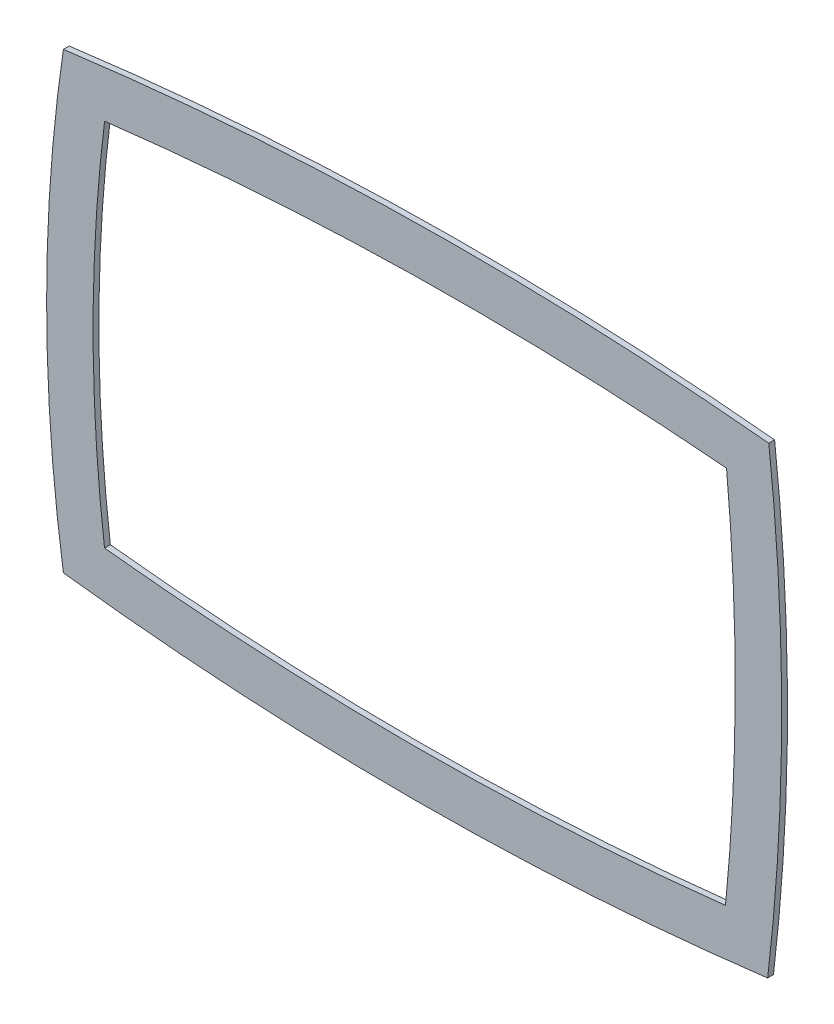
ISO-10303-21;
HEADER;
FILE_DESCRIPTION(('STEP AP214'),'2;1');
FILE_NAME('part.step','',(''),(''),'','','');
FILE_SCHEMA(('AUTOMOTIVE_DESIGN { 1 0 10303 214 1 1 1 1 }'));
ENDSEC;
DATA;
#1=APPLICATION_CONTEXT('core data for automotive mechanical design processes');
#2=APPLICATION_PROTOCOL_DEFINITION('international standard','automotive_design',2000,#1);
#3=PRODUCT_CONTEXT('',#1,'mechanical');
#4=PRODUCT('Part','Part','',(#3));
#5=PRODUCT_RELATED_PRODUCT_CATEGORY('part','',(#4));
#6=PRODUCT_DEFINITION_FORMATION('','',#4);
#7=PRODUCT_DEFINITION_CONTEXT('part definition',#1,'design');
#8=PRODUCT_DEFINITION('design','',#6,#7);
#9=PRODUCT_DEFINITION_SHAPE('','',#8);
#10=(LENGTH_UNIT() NAMED_UNIT(*) SI_UNIT(.MILLI.,.METRE.));
#11=(NAMED_UNIT(*) PLANE_ANGLE_UNIT() SI_UNIT($,.RADIAN.));
#12=(NAMED_UNIT(*) SI_UNIT($,.STERADIAN.) SOLID_ANGLE_UNIT());
#13=UNCERTAINTY_MEASURE_WITH_UNIT(LENGTH_MEASURE(1.E-05),#10,'distance_accuracy_value','');
#14=(GEOMETRIC_REPRESENTATION_CONTEXT(3) GLOBAL_UNCERTAINTY_ASSIGNED_CONTEXT((#13)) GLOBAL_UNIT_ASSIGNED_CONTEXT((#10,
#11,#12)) REPRESENTATION_CONTEXT('',''));
#15=CARTESIAN_POINT('',(0.,0.,0.));
#16=DIRECTION('',(0.,0.,1.));
#17=DIRECTION('',(1.,0.,0.));
#18=AXIS2_PLACEMENT_3D('',#15,#16,#17);
#19=CARTESIAN_POINT('',(0.,0.,0.05));
#20=DIRECTION('',(0.,0.,1.));
#21=DIRECTION('',(1.,0.,0.));
#22=AXIS2_PLACEMENT_3D('',#19,#20,#21);
#23=PLANE('',#22);
#24=CARTESIAN_POINT('',(10.28146360564,-0.07420751764335,0.05));
#25=DIRECTION('',(0.,0.,1.));
#26=DIRECTION('',(1.,0.,0.));
#27=AXIS2_PLACEMENT_3D('',#24,#25,#26);
#28=CIRCLE('',#27,12.87248318744);
#29=CARTESIAN_POINT('',(-2.49250575619559,-1.66371377865993,0.05));
#30=VERTEX_POINT('',#29);
#31=CARTESIAN_POINT('',(-2.49208272068601,1.51869475811894,0.05));
#32=VERTEX_POINT('',#31);
#33=EDGE_CURVE('E122',#30,#32,#28,.F.);
#34=ORIENTED_EDGE('',*,*,#33,.T.);
#35=CARTESIAN_POINT('',(0.6226355071522,-24.38683992378,0.05));
#36=DIRECTION('',(0.,0.,1.));
#37=DIRECTION('',(1.,0.,0.));
#38=AXIS2_PLACEMENT_3D('',#35,#36,#37);
#39=CIRCLE('',#38,26.09210985708);
#40=CARTESIAN_POINT('',(2.86177604570978,1.60901448500009,0.05));
#41=VERTEX_POINT('',#40);
#42=EDGE_CURVE('E131',#32,#41,#39,.F.);
#43=ORIENTED_EDGE('',*,*,#42,.T.);
#44=CARTESIAN_POINT('',(-13.94445100356,0.02340364021601,0.05));
#45=DIRECTION('',(0.,0.,1.));
#46=DIRECTION('',(1.,0.,0.));
#47=AXIS2_PLACEMENT_3D('',#44,#45,#46);
#48=CIRCLE('',#47,16.88085985318);
#49=CARTESIAN_POINT('',(2.85279013546879,-1.65472612233116,0.05));
#50=VERTEX_POINT('',#49);
#51=EDGE_CURVE('E128',#41,#50,#48,.F.);
#52=ORIENTED_EDGE('',*,*,#51,.T.);
#53=CARTESIAN_POINT('',(0.1394460000001,22.5443284803,0.05));
#54=DIRECTION('',(0.,0.,1.));
#55=DIRECTION('',(1.,0.,0.));
#56=AXIS2_PLACEMENT_3D('',#53,#54,#55);
#57=CIRCLE('',#56,24.35069773248);
#58=EDGE_CURVE('E125',#50,#30,#57,.F.);
#59=ORIENTED_EDGE('',*,*,#58,.T.);
#60=EDGE_LOOP('',(#34,#43,#52,#59));
#61=FACE_BOUND('',#60,.T.);
#62=CARTESIAN_POINT('',(10.28146360564,-0.07420751764323,0.05));
#63=DIRECTION('',(0.,0.,1.));
#64=DIRECTION('',(1.,0.,0.));
#65=AXIS2_PLACEMENT_3D('',#62,#63,#64);
#66=CIRCLE('',#65,13.27248318744);
#67=CARTESIAN_POINT('',(-2.84678960030275,-2.02556031033125,0.05));
#68=VERTEX_POINT('',#67);
#69=CARTESIAN_POINT('',(-2.84679521254649,1.87710751678514,0.05));
#70=VERTEX_POINT('',#69);
#71=EDGE_CURVE('E91',#68,#70,#66,.F.);
#72=ORIENTED_EDGE('',*,*,#71,.F.);
#73=CARTESIAN_POINT('',(0.1394460000001,22.5443284803,0.05));
#74=DIRECTION('',(0.,0.,1.));
#75=DIRECTION('',(1.,0.,0.));
#76=AXIS2_PLACEMENT_3D('',#73,#74,#75);
#77=CIRCLE('',#76,24.75069773248);
#78=CARTESIAN_POINT('',(3.21583247942406,-2.01443542331993,0.05));
#79=VERTEX_POINT('',#78);
#80=EDGE_CURVE('E20',#79,#68,#77,.F.);
#81=ORIENTED_EDGE('',*,*,#80,.F.);
#82=CARTESIAN_POINT('',(-13.94445100356,0.02340364021598,0.05));
#83=DIRECTION('',(0.,0.,1.));
#84=DIRECTION('',(1.,0.,0.));
#85=AXIS2_PLACEMENT_3D('',#82,#83,#84);
#86=CIRCLE('',#85,17.28085985318);
#87=CARTESIAN_POINT('',(3.22561768964782,1.97708179582017,0.05));
#88=VERTEX_POINT('',#87);
#89=EDGE_CURVE('E79',#88,#79,#86,.F.);
#90=ORIENTED_EDGE('',*,*,#89,.F.);
#91=CARTESIAN_POINT('',(0.6226355071522,-24.38683992378,0.05));
#92=DIRECTION('',(0.,0.,1.));
#93=DIRECTION('',(1.,0.,0.));
#94=AXIS2_PLACEMENT_3D('',#91,#92,#93);
#95=CIRCLE('',#94,26.49210985708);
#96=EDGE_CURVE('E98',#70,#88,#95,.F.);
#97=ORIENTED_EDGE('',*,*,#96,.F.);
#98=EDGE_LOOP('',(#72,#81,#90,#97));
#99=FACE_BOUND('',#98,.T.);
#100=ADVANCED_FACE('F17',(#61,#99),#23,.T.);
#101=CARTESIAN_POINT('',(0.1394460000001,22.5443284803,0.));
#102=DIRECTION('',(0.,0.,1.));
#103=DIRECTION('',(1.,0.,0.));
#104=AXIS2_PLACEMENT_3D('',#101,#102,#103);
#105=CYLINDRICAL_SURFACE('',#104,24.75069773248);
#106=DIRECTION('',(0.,0.,1.));
#107=VECTOR('',#106,1.);
#108=CARTESIAN_POINT('',(-2.84678960030302,-2.02556031032944,0.));
#109=LINE('',#108,#107);
#110=CARTESIAN_POINT('',(-2.84678960030275,-2.02556031033125,0.));
#111=VERTEX_POINT('',#110);
#112=EDGE_CURVE('E134',#111,#68,#109,.T.);
#113=ORIENTED_EDGE('',*,*,#112,.F.);
#114=CARTESIAN_POINT('',(0.1394460000001,22.5443284803,0.));
#115=DIRECTION('',(0.,0.,1.));
#116=DIRECTION('',(1.,0.,0.));
#117=AXIS2_PLACEMENT_3D('',#114,#115,#116);
#118=CIRCLE('',#117,24.75069773248);
#119=CARTESIAN_POINT('',(3.21583247942406,-2.01443542331993,0.));
#120=VERTEX_POINT('',#119);
#121=EDGE_CURVE('E97',#111,#120,#118,.T.);
#122=ORIENTED_EDGE('',*,*,#121,.T.);
#123=DIRECTION('',(0.,0.,1.));
#124=VECTOR('',#123,1.);
#125=CARTESIAN_POINT('',(3.21583247942421,-2.01443542331862,0.));
#126=LINE('',#125,#124);
#127=EDGE_CURVE('E84',#79,#120,#126,.F.);
#128=ORIENTED_EDGE('',*,*,#127,.F.);
#129=ORIENTED_EDGE('',*,*,#80,.T.);
#130=EDGE_LOOP('',(#113,#122,#128,#129));
#131=FACE_BOUND('',#130,.T.);
#132=ADVANCED_FACE('F96',(#131),#105,.T.);
#133=CARTESIAN_POINT('',(-13.94445100356,0.02340364021598,0.));
#134=DIRECTION('',(0.,0.,1.));
#135=DIRECTION('',(1.,0.,0.));
#136=AXIS2_PLACEMENT_3D('',#133,#134,#135);
#137=CYLINDRICAL_SURFACE('',#136,17.28085985318);
#138=ORIENTED_EDGE('',*,*,#127,.T.);
#139=CARTESIAN_POINT('',(-13.94445100356,0.02340364021598,0.));
#140=DIRECTION('',(0.,0.,1.));
#141=DIRECTION('',(1.,0.,0.));
#142=AXIS2_PLACEMENT_3D('',#139,#140,#141);
#143=CIRCLE('',#142,17.28085985318);
#144=CARTESIAN_POINT('',(3.22561768964782,1.97708179582017,0.));
#145=VERTEX_POINT('',#144);
#146=EDGE_CURVE('E118',#120,#145,#143,.T.);
#147=ORIENTED_EDGE('',*,*,#146,.T.);
#148=DIRECTION('',(0.,0.,1.));
#149=VECTOR('',#148,1.);
#150=CARTESIAN_POINT('',(3.22561768964524,1.97708179582043,0.));
#151=LINE('',#150,#149);
#152=EDGE_CURVE('E86',#88,#145,#151,.F.);
#153=ORIENTED_EDGE('',*,*,#152,.F.);
#154=ORIENTED_EDGE('',*,*,#89,.T.);
#155=EDGE_LOOP('',(#138,#147,#153,#154));
#156=FACE_BOUND('',#155,.T.);
#157=ADVANCED_FACE('F81',(#156),#137,.T.);
#158=CARTESIAN_POINT('',(0.6226355071522,-24.38683992378,0.));
#159=DIRECTION('',(0.,0.,1.));
#160=DIRECTION('',(1.,0.,0.));
#161=AXIS2_PLACEMENT_3D('',#158,#159,#160);
#162=CYLINDRICAL_SURFACE('',#161,26.49210985708);
#163=ORIENTED_EDGE('',*,*,#152,.T.);
#164=CARTESIAN_POINT('',(0.6226355071522,-24.38683992378,0.));
#165=DIRECTION('',(0.,0.,1.));
#166=DIRECTION('',(1.,0.,0.));
#167=AXIS2_PLACEMENT_3D('',#164,#165,#166);
#168=CIRCLE('',#167,26.49210985708);
#169=CARTESIAN_POINT('',(-2.84679521254649,1.87710751678514,0.));
#170=VERTEX_POINT('',#169);
#171=EDGE_CURVE('E115',#145,#170,#168,.T.);
#172=ORIENTED_EDGE('',*,*,#171,.T.);
#173=DIRECTION('',(0.,0.,1.));
#174=VECTOR('',#173,1.);
#175=CARTESIAN_POINT('',(-2.8467952125466,1.87710751678439,0.));
#176=LINE('',#175,#174);
#177=EDGE_CURVE('E133',#70,#170,#176,.F.);
#178=ORIENTED_EDGE('',*,*,#177,.F.);
#179=ORIENTED_EDGE('',*,*,#96,.T.);
#180=EDGE_LOOP('',(#163,#172,#178,#179));
#181=FACE_BOUND('',#180,.T.);
#182=ADVANCED_FACE('F181',(#181),#162,.T.);
#183=CARTESIAN_POINT('',(10.28146360564,-0.07420751764323,0.));
#184=DIRECTION('',(0.,0.,1.));
#185=DIRECTION('',(1.,0.,0.));
#186=AXIS2_PLACEMENT_3D('',#183,#184,#185);
#187=CYLINDRICAL_SURFACE('',#186,13.27248318744);
#188=ORIENTED_EDGE('',*,*,#177,.T.);
#189=CARTESIAN_POINT('',(10.28146360564,-0.07420751764323,0.));
#190=DIRECTION('',(0.,0.,1.));
#191=DIRECTION('',(1.,0.,0.));
#192=AXIS2_PLACEMENT_3D('',#189,#190,#191);
#193=CIRCLE('',#192,13.27248318744);
#194=EDGE_CURVE('E112',#170,#111,#193,.T.);
#195=ORIENTED_EDGE('',*,*,#194,.T.);
#196=ORIENTED_EDGE('',*,*,#112,.T.);
#197=ORIENTED_EDGE('',*,*,#71,.T.);
#198=EDGE_LOOP('',(#188,#195,#196,#197));
#199=FACE_BOUND('',#198,.T.);
#200=ADVANCED_FACE('F178',(#199),#187,.T.);
#201=CARTESIAN_POINT('',(0.6226355071522,-24.38683992378,0.));
#202=DIRECTION('',(0.,0.,1.));
#203=DIRECTION('',(1.,0.,0.));
#204=AXIS2_PLACEMENT_3D('',#201,#202,#203);
#205=CYLINDRICAL_SURFACE('',#204,26.09210985708);
#206=ORIENTED_EDGE('',*,*,#42,.F.);
#207=DIRECTION('',(0.,0.,1.));
#208=VECTOR('',#207,1.);
#209=CARTESIAN_POINT('',(-2.4920827206861,1.51869475811826,0.));
#210=LINE('',#209,#208);
#211=CARTESIAN_POINT('',(-2.49208272068601,1.51869475811894,0.));
#212=VERTEX_POINT('',#211);
#213=EDGE_CURVE('E121',#32,#212,#210,.F.);
#214=ORIENTED_EDGE('',*,*,#213,.T.);
#215=CARTESIAN_POINT('',(0.6226355071522,-24.38683992378,0.));
#216=DIRECTION('',(0.,0.,1.));
#217=DIRECTION('',(1.,0.,0.));
#218=AXIS2_PLACEMENT_3D('',#215,#216,#217);
#219=CIRCLE('',#218,26.09210985708);
#220=CARTESIAN_POINT('',(2.86177604570978,1.60901448500009,0.));
#221=VERTEX_POINT('',#220);
#222=EDGE_CURVE('E109',#212,#221,#219,.F.);
#223=ORIENTED_EDGE('',*,*,#222,.T.);
#224=DIRECTION('',(0.,0.,1.));
#225=VECTOR('',#224,1.);
#226=CARTESIAN_POINT('',(2.86177604570983,1.60901448499955,0.));
#227=LINE('',#226,#225);
#228=EDGE_CURVE('E130',#221,#41,#227,.T.);
#229=ORIENTED_EDGE('',*,*,#228,.T.);
#230=EDGE_LOOP('',(#206,#214,#223,#229));
#231=FACE_BOUND('',#230,.T.);
#232=ADVANCED_FACE('F146',(#231),#205,.F.);
#233=CARTESIAN_POINT('',(-13.94445100356,0.02340364021601,0.));
#234=DIRECTION('',(0.,0.,1.));
#235=DIRECTION('',(1.,0.,0.));
#236=AXIS2_PLACEMENT_3D('',#233,#234,#235);
#237=CYLINDRICAL_SURFACE('',#236,16.88085985318);
#238=ORIENTED_EDGE('',*,*,#51,.F.);
#239=ORIENTED_EDGE('',*,*,#228,.F.);
#240=CARTESIAN_POINT('',(-13.94445100356,0.02340364021601,0.));
#241=DIRECTION('',(0.,0.,1.));
#242=DIRECTION('',(1.,0.,0.));
#243=AXIS2_PLACEMENT_3D('',#240,#241,#242);
#244=CIRCLE('',#243,16.88085985318);
#245=CARTESIAN_POINT('',(2.85279013546879,-1.65472612233116,0.));
#246=VERTEX_POINT('',#245);
#247=EDGE_CURVE('E106',#221,#246,#244,.F.);
#248=ORIENTED_EDGE('',*,*,#247,.T.);
#249=DIRECTION('',(0.,0.,1.));
#250=VECTOR('',#249,1.);
#251=CARTESIAN_POINT('',(2.85279013546648,-1.65472612233142,0.));
#252=LINE('',#251,#250);
#253=EDGE_CURVE('E127',#246,#50,#252,.T.);
#254=ORIENTED_EDGE('',*,*,#253,.T.);
#255=EDGE_LOOP('',(#238,#239,#248,#254));
#256=FACE_BOUND('',#255,.T.);
#257=ADVANCED_FACE('F158',(#256),#237,.F.);
#258=CARTESIAN_POINT('',(0.1394460000001,22.5443284803,0.));
#259=DIRECTION('',(0.,0.,1.));
#260=DIRECTION('',(1.,0.,0.));
#261=AXIS2_PLACEMENT_3D('',#258,#259,#260);
#262=CYLINDRICAL_SURFACE('',#261,24.35069773248);
#263=ORIENTED_EDGE('',*,*,#58,.F.);
#264=ORIENTED_EDGE('',*,*,#253,.F.);
#265=CARTESIAN_POINT('',(0.1394460000001,22.5443284803,0.));
#266=DIRECTION('',(0.,0.,1.));
#267=DIRECTION('',(1.,0.,0.));
#268=AXIS2_PLACEMENT_3D('',#265,#266,#267);
#269=CIRCLE('',#268,24.35069773248);
#270=CARTESIAN_POINT('',(-2.4925057561956,-1.66371377865992,0.));
#271=VERTEX_POINT('',#270);
#272=EDGE_CURVE('E26',#246,#271,#269,.F.);
#273=ORIENTED_EDGE('',*,*,#272,.T.);
#274=DIRECTION('',(0.,0.,1.));
#275=VECTOR('',#274,1.);
#276=CARTESIAN_POINT('',(-2.49250575619579,-1.66371377865834,0.));
#277=LINE('',#276,#275);
#278=EDGE_CURVE('E34',#271,#30,#277,.T.);
#279=ORIENTED_EDGE('',*,*,#278,.T.);
#280=EDGE_LOOP('',(#263,#264,#273,#279));
#281=FACE_BOUND('',#280,.T.);
#282=ADVANCED_FACE('F155',(#281),#262,.F.);
#283=CARTESIAN_POINT('',(10.28146360564,-0.07420751764335,0.));
#284=DIRECTION('',(0.,0.,1.));
#285=DIRECTION('',(1.,0.,0.));
#286=AXIS2_PLACEMENT_3D('',#283,#284,#285);
#287=CYLINDRICAL_SURFACE('',#286,12.87248318744);
#288=ORIENTED_EDGE('',*,*,#33,.F.);
#289=ORIENTED_EDGE('',*,*,#278,.F.);
#290=CARTESIAN_POINT('',(10.28146360564,-0.07420751764335,0.));
#291=DIRECTION('',(0.,0.,1.));
#292=DIRECTION('',(1.,0.,0.));
#293=AXIS2_PLACEMENT_3D('',#290,#291,#292);
#294=CIRCLE('',#293,12.87248318744);
#295=EDGE_CURVE('E11',#271,#212,#294,.F.);
#296=ORIENTED_EDGE('',*,*,#295,.T.);
#297=ORIENTED_EDGE('',*,*,#213,.F.);
#298=EDGE_LOOP('',(#288,#289,#296,#297));
#299=FACE_BOUND('',#298,.T.);
#300=ADVANCED_FACE('F147',(#299),#287,.F.);
#301=CARTESIAN_POINT('',(0.,0.,0.));
#302=DIRECTION('',(0.,0.,1.));
#303=DIRECTION('',(1.,0.,0.));
#304=AXIS2_PLACEMENT_3D('',#301,#302,#303);
#305=PLANE('',#304);
#306=ORIENTED_EDGE('',*,*,#272,.F.);
#307=ORIENTED_EDGE('',*,*,#247,.F.);
#308=ORIENTED_EDGE('',*,*,#222,.F.);
#309=ORIENTED_EDGE('',*,*,#295,.F.);
#310=EDGE_LOOP('',(#306,#307,#308,#309));
#311=FACE_BOUND('',#310,.T.);
#312=ORIENTED_EDGE('',*,*,#171,.F.);
#313=ORIENTED_EDGE('',*,*,#146,.F.);
#314=ORIENTED_EDGE('',*,*,#121,.F.);
#315=ORIENTED_EDGE('',*,*,#194,.F.);
#316=EDGE_LOOP('',(#312,#313,#314,#315));
#317=FACE_BOUND('',#316,.T.);
#318=ADVANCED_FACE('F150',(#311,#317),#305,.F.);
#319=CLOSED_SHELL('',(#100,#132,#157,#182,#200,#232,#257,#282,#300,#318));
#320=MANIFOLD_SOLID_BREP('B1',#319);
#321=ADVANCED_BREP_SHAPE_REPRESENTATION('',(#18,#320),#14);
#322=SHAPE_DEFINITION_REPRESENTATION(#9,#321);
ENDSEC;
END-ISO-10303-21;
